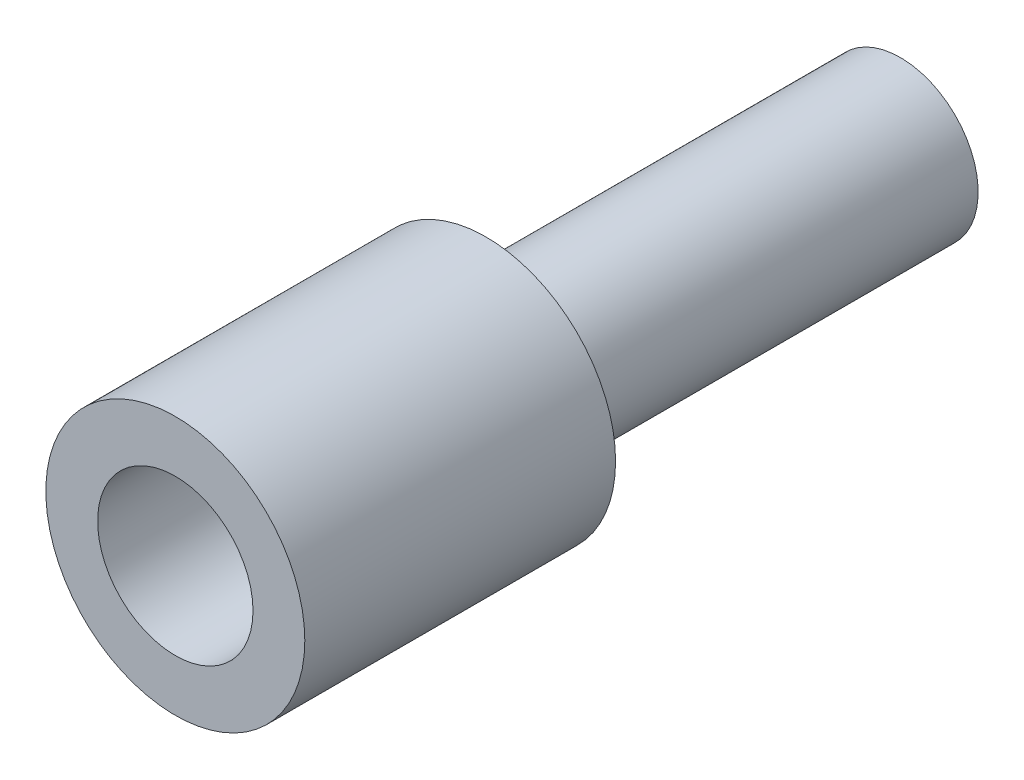
ISO-10303-21;
HEADER;
FILE_DESCRIPTION(('STEP AP214'),'2;1');
FILE_NAME('part.step','',(''),(''),'','','');
FILE_SCHEMA(('AUTOMOTIVE_DESIGN { 1 0 10303 214 1 1 1 1 }'));
ENDSEC;
DATA;
#1=APPLICATION_CONTEXT('core data for automotive mechanical design processes');
#2=APPLICATION_PROTOCOL_DEFINITION('international standard','automotive_design',2000,#1);
#3=PRODUCT_CONTEXT('',#1,'mechanical');
#4=PRODUCT('Part','Part','',(#3));
#5=PRODUCT_RELATED_PRODUCT_CATEGORY('part','',(#4));
#6=PRODUCT_DEFINITION_FORMATION('','',#4);
#7=PRODUCT_DEFINITION_CONTEXT('part definition',#1,'design');
#8=PRODUCT_DEFINITION('design','',#6,#7);
#9=PRODUCT_DEFINITION_SHAPE('','',#8);
#10=(LENGTH_UNIT() NAMED_UNIT(*) SI_UNIT(.MILLI.,.METRE.));
#11=(NAMED_UNIT(*) PLANE_ANGLE_UNIT() SI_UNIT($,.RADIAN.));
#12=(NAMED_UNIT(*) SI_UNIT($,.STERADIAN.) SOLID_ANGLE_UNIT());
#13=UNCERTAINTY_MEASURE_WITH_UNIT(LENGTH_MEASURE(1.E-05),#10,'distance_accuracy_value','');
#14=(GEOMETRIC_REPRESENTATION_CONTEXT(3) GLOBAL_UNCERTAINTY_ASSIGNED_CONTEXT((#13)) GLOBAL_UNIT_ASSIGNED_CONTEXT((#10,
#11,#12)) REPRESENTATION_CONTEXT('',''));
#15=CARTESIAN_POINT('',(0.,0.,0.));
#16=DIRECTION('',(0.,0.,1.));
#17=DIRECTION('',(1.,0.,0.));
#18=AXIS2_PLACEMENT_3D('',#15,#16,#17);
#19=CARTESIAN_POINT('',(0.,0.,6.));
#20=DIRECTION('',(0.,0.,-1.));
#21=DIRECTION('',(-1.,0.,0.));
#22=AXIS2_PLACEMENT_3D('',#19,#20,#21);
#23=CYLINDRICAL_SURFACE('',#22,2.5);
#24=CARTESIAN_POINT('',(0.,0.,6.));
#25=DIRECTION('',(0.,0.,1.));
#26=DIRECTION('',(1.,0.,0.));
#27=AXIS2_PLACEMENT_3D('',#24,#25,#26);
#28=CIRCLE('',#27,2.5);
#29=CARTESIAN_POINT('',(2.5,0.,6.));
#30=VERTEX_POINT('',#29);
#31=EDGE_CURVE('E38',#30,#30,#28,.T.);
#32=ORIENTED_EDGE('',*,*,#31,.F.);
#33=EDGE_LOOP('',(#32));
#34=FACE_BOUND('',#33,.T.);
#35=CARTESIAN_POINT('',(0.,0.,0.));
#36=DIRECTION('',(0.,0.,1.));
#37=DIRECTION('',(1.,0.,0.));
#38=AXIS2_PLACEMENT_3D('',#35,#36,#37);
#39=CIRCLE('',#38,2.5);
#40=CARTESIAN_POINT('',(2.5,0.,0.));
#41=VERTEX_POINT('',#40);
#42=EDGE_CURVE('E34',#41,#41,#39,.T.);
#43=ORIENTED_EDGE('',*,*,#42,.T.);
#44=EDGE_LOOP('',(#43));
#45=FACE_BOUND('',#44,.T.);
#46=ADVANCED_FACE('F31',(#34,#45),#23,.T.);
#47=CARTESIAN_POINT('',(0.,0.,6.));
#48=DIRECTION('',(0.,0.,1.));
#49=DIRECTION('',(1.,0.,0.));
#50=AXIS2_PLACEMENT_3D('',#47,#48,#49);
#51=PLANE('',#50);
#52=CARTESIAN_POINT('',(0.,0.,6.));
#53=DIRECTION('',(0.,0.,1.));
#54=DIRECTION('',(1.,0.,0.));
#55=AXIS2_PLACEMENT_3D('',#52,#53,#54);
#56=CIRCLE('',#55,1.5);
#57=CARTESIAN_POINT('',(1.5,0.,6.));
#58=VERTEX_POINT('',#57);
#59=EDGE_CURVE('E49',#58,#58,#56,.T.);
#60=ORIENTED_EDGE('',*,*,#59,.F.);
#61=EDGE_LOOP('',(#60));
#62=FACE_BOUND('',#61,.T.);
#63=ORIENTED_EDGE('',*,*,#31,.T.);
#64=EDGE_LOOP('',(#63));
#65=FACE_BOUND('',#64,.T.);
#66=ADVANCED_FACE('F71',(#62,#65),#51,.T.);
#67=CARTESIAN_POINT('',(0.,0.,0.));
#68=DIRECTION('',(0.,0.,1.));
#69=DIRECTION('',(1.,0.,0.));
#70=AXIS2_PLACEMENT_3D('',#67,#68,#69);
#71=PLANE('',#70);
#72=CARTESIAN_POINT('',(0.,0.,0.));
#73=DIRECTION('',(0.,0.,-1.));
#74=DIRECTION('',(-1.,0.,0.));
#75=AXIS2_PLACEMENT_3D('',#72,#73,#74);
#76=CIRCLE('',#75,1.5);
#77=CARTESIAN_POINT('',(-1.5,0.,0.));
#78=VERTEX_POINT('',#77);
#79=EDGE_CURVE('E10',#78,#78,#76,.T.);
#80=ORIENTED_EDGE('',*,*,#79,.F.);
#81=EDGE_LOOP('',(#80));
#82=FACE_BOUND('',#81,.T.);
#83=ORIENTED_EDGE('',*,*,#42,.F.);
#84=EDGE_LOOP('',(#83));
#85=FACE_BOUND('',#84,.T.);
#86=ADVANCED_FACE('F76',(#82,#85),#71,.F.);
#87=CARTESIAN_POINT('',(0.,0.,1.));
#88=DIRECTION('',(0.,0.,1.));
#89=DIRECTION('',(1.,0.,0.));
#90=AXIS2_PLACEMENT_3D('',#87,#88,#89);
#91=CYLINDRICAL_SURFACE('',#90,1.5);
#92=CARTESIAN_POINT('',(0.,0.,1.));
#93=DIRECTION('',(0.,0.,1.));
#94=DIRECTION('',(1.,0.,0.));
#95=AXIS2_PLACEMENT_3D('',#92,#93,#94);
#96=CIRCLE('',#95,1.5);
#97=CARTESIAN_POINT('',(1.5,0.,1.));
#98=VERTEX_POINT('',#97);
#99=EDGE_CURVE('E46',#98,#98,#96,.T.);
#100=ORIENTED_EDGE('',*,*,#99,.F.);
#101=EDGE_LOOP('',(#100));
#102=FACE_BOUND('',#101,.T.);
#103=ORIENTED_EDGE('',*,*,#59,.T.);
#104=EDGE_LOOP('',(#103));
#105=FACE_BOUND('',#104,.T.);
#106=ADVANCED_FACE('F67',(#102,#105),#91,.F.);
#107=CARTESIAN_POINT('',(0.,0.,1.));
#108=DIRECTION('',(0.,0.,1.));
#109=DIRECTION('',(1.,0.,0.));
#110=AXIS2_PLACEMENT_3D('',#107,#108,#109);
#111=PLANE('',#110);
#112=ORIENTED_EDGE('',*,*,#99,.T.);
#113=EDGE_LOOP('',(#112));
#114=FACE_BOUND('',#113,.T.);
#115=ADVANCED_FACE('F60',(#114),#111,.T.);
#116=CARTESIAN_POINT('',(0.,0.,-8.));
#117=DIRECTION('',(0.,0.,1.));
#118=DIRECTION('',(1.,0.,0.));
#119=AXIS2_PLACEMENT_3D('',#116,#117,#118);
#120=CYLINDRICAL_SURFACE('',#119,1.5);
#121=CARTESIAN_POINT('',(0.,0.,-8.));
#122=DIRECTION('',(0.,0.,-1.));
#123=DIRECTION('',(-1.,0.,0.));
#124=AXIS2_PLACEMENT_3D('',#121,#122,#123);
#125=CIRCLE('',#124,1.5);
#126=CARTESIAN_POINT('',(-1.5,0.,-8.));
#127=VERTEX_POINT('',#126);
#128=EDGE_CURVE('E45',#127,#127,#125,.T.);
#129=ORIENTED_EDGE('',*,*,#128,.F.);
#130=EDGE_LOOP('',(#129));
#131=FACE_BOUND('',#130,.T.);
#132=ORIENTED_EDGE('',*,*,#79,.T.);
#133=EDGE_LOOP('',(#132));
#134=FACE_BOUND('',#133,.T.);
#135=ADVANCED_FACE('F58',(#131,#134),#120,.T.);
#136=CARTESIAN_POINT('',(0.,0.,-8.));
#137=DIRECTION('',(0.,0.,-1.));
#138=DIRECTION('',(-1.,0.,0.));
#139=AXIS2_PLACEMENT_3D('',#136,#137,#138);
#140=PLANE('',#139);
#141=ORIENTED_EDGE('',*,*,#128,.T.);
#142=EDGE_LOOP('',(#141));
#143=FACE_BOUND('',#142,.T.);
#144=ADVANCED_FACE('F56',(#143),#140,.T.);
#145=CLOSED_SHELL('',(#46,#66,#86,#106,#115,#135,#144));
#146=MANIFOLD_SOLID_BREP('B2',#145);
#147=ADVANCED_BREP_SHAPE_REPRESENTATION('',(#18,#146),#14);
#148=SHAPE_DEFINITION_REPRESENTATION(#9,#147);
ENDSEC;
END-ISO-10303-21;
